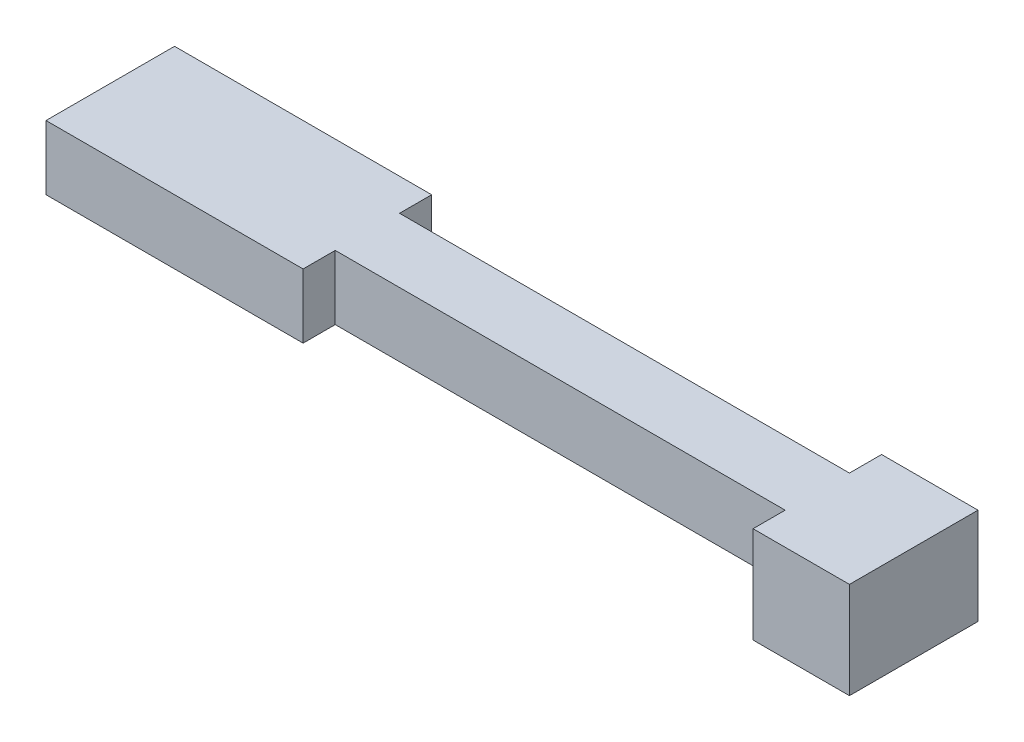
ISO-10303-21;
HEADER;
FILE_DESCRIPTION(('STEP AP214'),'2;1');
FILE_NAME('part.step','',(''),(''),'','','');
FILE_SCHEMA(('AUTOMOTIVE_DESIGN { 1 0 10303 214 1 1 1 1 }'));
ENDSEC;
DATA;
#1=APPLICATION_CONTEXT('core data for automotive mechanical design processes');
#2=APPLICATION_PROTOCOL_DEFINITION('international standard','automotive_design',2000,#1);
#3=PRODUCT_CONTEXT('',#1,'mechanical');
#4=PRODUCT('Part','Part','',(#3));
#5=PRODUCT_RELATED_PRODUCT_CATEGORY('part','',(#4));
#6=PRODUCT_DEFINITION_FORMATION('','',#4);
#7=PRODUCT_DEFINITION_CONTEXT('part definition',#1,'design');
#8=PRODUCT_DEFINITION('design','',#6,#7);
#9=PRODUCT_DEFINITION_SHAPE('','',#8);
#10=(LENGTH_UNIT() NAMED_UNIT(*) SI_UNIT(.MILLI.,.METRE.));
#11=(NAMED_UNIT(*) PLANE_ANGLE_UNIT() SI_UNIT($,.RADIAN.));
#12=(NAMED_UNIT(*) SI_UNIT($,.STERADIAN.) SOLID_ANGLE_UNIT());
#13=UNCERTAINTY_MEASURE_WITH_UNIT(LENGTH_MEASURE(1.E-05),#10,'distance_accuracy_value','');
#14=(GEOMETRIC_REPRESENTATION_CONTEXT(3) GLOBAL_UNCERTAINTY_ASSIGNED_CONTEXT((#13)) GLOBAL_UNIT_ASSIGNED_CONTEXT((#10,
#11,#12)) REPRESENTATION_CONTEXT('',''));
#15=CARTESIAN_POINT('',(0.,0.,0.));
#16=DIRECTION('',(0.,0.,1.));
#17=DIRECTION('',(1.,0.,0.));
#18=AXIS2_PLACEMENT_3D('',#15,#16,#17);
#19=CARTESIAN_POINT('',(0.,10.,-4.99999999999997));
#20=DIRECTION('',(0.,0.,-1.));
#21=DIRECTION('',(-1.,0.,0.));
#22=AXIS2_PLACEMENT_3D('',#19,#20,#21);
#23=PLANE('',#22);
#24=DIRECTION('',(1.,0.,0.));
#25=VECTOR('',#24,1.);
#26=CARTESIAN_POINT('',(0.,0.,-4.99999999999997));
#27=LINE('',#26,#25);
#28=CARTESIAN_POINT('',(20.,0.,-5.));
#29=VERTEX_POINT('',#28);
#30=CARTESIAN_POINT('',(90.,0.,-5.00000000000002));
#31=VERTEX_POINT('',#30);
#32=EDGE_CURVE('E214',#29,#31,#27,.T.);
#33=ORIENTED_EDGE('',*,*,#32,.F.);
#34=DIRECTION('',(0.,-1.,0.));
#35=VECTOR('',#34,1.);
#36=CARTESIAN_POINT('',(20.,10.,-5.));
#37=LINE('',#36,#35);
#38=CARTESIAN_POINT('',(20.,10.,-5.));
#39=VERTEX_POINT('',#38);
#40=EDGE_CURVE('E41',#39,#29,#37,.T.);
#41=ORIENTED_EDGE('',*,*,#40,.F.);
#42=DIRECTION('',(1.,0.,0.));
#43=VECTOR('',#42,1.);
#44=CARTESIAN_POINT('',(0.,10.,-4.99999999999997));
#45=LINE('',#44,#43);
#46=CARTESIAN_POINT('',(90.,10.,-5.00000000000002));
#47=VERTEX_POINT('',#46);
#48=EDGE_CURVE('E89',#39,#47,#45,.T.);
#49=ORIENTED_EDGE('',*,*,#48,.T.);
#50=DIRECTION('',(0.,-1.,0.));
#51=VECTOR('',#50,1.);
#52=CARTESIAN_POINT('',(90.,10.,-5.00000000000002));
#53=LINE('',#52,#51);
#54=EDGE_CURVE('E11',#47,#31,#53,.T.);
#55=ORIENTED_EDGE('',*,*,#54,.T.);
#56=EDGE_LOOP('',(#33,#41,#49,#55));
#57=FACE_BOUND('',#56,.T.);
#58=ADVANCED_FACE('F33',(#57),#23,.T.);
#59=CARTESIAN_POINT('',(20.,10.,0.));
#60=DIRECTION('',(-1.,0.,0.));
#61=DIRECTION('',(0.,0.,1.));
#62=AXIS2_PLACEMENT_3D('',#59,#60,#61);
#63=PLANE('',#62);
#64=DIRECTION('',(0.,0.,-1.));
#65=VECTOR('',#64,1.);
#66=CARTESIAN_POINT('',(20.,0.,0.));
#67=LINE('',#66,#65);
#68=CARTESIAN_POINT('',(20.,0.,-10.));
#69=VERTEX_POINT('',#68);
#70=EDGE_CURVE('E221',#29,#69,#67,.T.);
#71=ORIENTED_EDGE('',*,*,#70,.T.);
#72=DIRECTION('',(0.,-1.,0.));
#73=VECTOR('',#72,1.);
#74=CARTESIAN_POINT('',(20.,10.,-10.));
#75=LINE('',#74,#73);
#76=CARTESIAN_POINT('',(20.,10.,-10.));
#77=VERTEX_POINT('',#76);
#78=EDGE_CURVE('E237',#77,#69,#75,.T.);
#79=ORIENTED_EDGE('',*,*,#78,.F.);
#80=DIRECTION('',(0.,0.,-1.));
#81=VECTOR('',#80,1.);
#82=CARTESIAN_POINT('',(20.,10.,0.));
#83=LINE('',#82,#81);
#84=EDGE_CURVE('E121',#39,#77,#83,.T.);
#85=ORIENTED_EDGE('',*,*,#84,.F.);
#86=ORIENTED_EDGE('',*,*,#40,.T.);
#87=EDGE_LOOP('',(#71,#79,#85,#86));
#88=FACE_BOUND('',#87,.T.);
#89=ADVANCED_FACE('F239',(#88),#63,.F.);
#90=CARTESIAN_POINT('',(0.,10.,-10.));
#91=DIRECTION('',(0.,0.,-1.));
#92=DIRECTION('',(-1.,0.,0.));
#93=AXIS2_PLACEMENT_3D('',#90,#91,#92);
#94=PLANE('',#93);
#95=DIRECTION('',(1.,0.,0.));
#96=VECTOR('',#95,1.);
#97=CARTESIAN_POINT('',(0.,0.,-10.));
#98=LINE('',#97,#96);
#99=CARTESIAN_POINT('',(-20.,0.,-10.));
#100=VERTEX_POINT('',#99);
#101=EDGE_CURVE('E223',#100,#69,#98,.T.);
#102=ORIENTED_EDGE('',*,*,#101,.F.);
#103=DIRECTION('',(0.,-1.,0.));
#104=VECTOR('',#103,1.);
#105=CARTESIAN_POINT('',(-20.,10.,-10.));
#106=LINE('',#105,#104);
#107=CARTESIAN_POINT('',(-20.,10.,-10.));
#108=VERTEX_POINT('',#107);
#109=EDGE_CURVE('E235',#108,#100,#106,.T.);
#110=ORIENTED_EDGE('',*,*,#109,.F.);
#111=DIRECTION('',(1.,0.,0.));
#112=VECTOR('',#111,1.);
#113=CARTESIAN_POINT('',(0.,10.,-10.));
#114=LINE('',#113,#112);
#115=EDGE_CURVE('E126',#108,#77,#114,.T.);
#116=ORIENTED_EDGE('',*,*,#115,.T.);
#117=ORIENTED_EDGE('',*,*,#78,.T.);
#118=EDGE_LOOP('',(#102,#110,#116,#117));
#119=FACE_BOUND('',#118,.T.);
#120=ADVANCED_FACE('F242',(#119),#94,.T.);
#121=CARTESIAN_POINT('',(-20.,10.,0.));
#122=DIRECTION('',(-1.,0.,0.));
#123=DIRECTION('',(0.,0.,1.));
#124=AXIS2_PLACEMENT_3D('',#121,#122,#123);
#125=PLANE('',#124);
#126=DIRECTION('',(0.,0.,-1.));
#127=VECTOR('',#126,1.);
#128=CARTESIAN_POINT('',(-20.,0.,0.));
#129=LINE('',#128,#127);
#130=CARTESIAN_POINT('',(-20.,0.,10.));
#131=VERTEX_POINT('',#130);
#132=EDGE_CURVE('E228',#131,#100,#129,.T.);
#133=ORIENTED_EDGE('',*,*,#132,.F.);
#134=DIRECTION('',(0.,-1.,0.));
#135=VECTOR('',#134,1.);
#136=CARTESIAN_POINT('',(-20.,10.,10.));
#137=LINE('',#136,#135);
#138=CARTESIAN_POINT('',(-20.,10.,10.));
#139=VERTEX_POINT('',#138);
#140=EDGE_CURVE('E116',#139,#131,#137,.T.);
#141=ORIENTED_EDGE('',*,*,#140,.F.);
#142=DIRECTION('',(0.,0.,-1.));
#143=VECTOR('',#142,1.);
#144=CARTESIAN_POINT('',(-20.,10.,0.));
#145=LINE('',#144,#143);
#146=EDGE_CURVE('E112',#139,#108,#145,.T.);
#147=ORIENTED_EDGE('',*,*,#146,.T.);
#148=ORIENTED_EDGE('',*,*,#109,.T.);
#149=EDGE_LOOP('',(#133,#141,#147,#148));
#150=FACE_BOUND('',#149,.T.);
#151=ADVANCED_FACE('F245',(#150),#125,.T.);
#152=CARTESIAN_POINT('',(0.,10.,10.));
#153=DIRECTION('',(0.,0.,-1.));
#154=DIRECTION('',(-1.,0.,0.));
#155=AXIS2_PLACEMENT_3D('',#152,#153,#154);
#156=PLANE('',#155);
#157=DIRECTION('',(1.,0.,0.));
#158=VECTOR('',#157,1.);
#159=CARTESIAN_POINT('',(0.,0.,10.));
#160=LINE('',#159,#158);
#161=CARTESIAN_POINT('',(20.,0.,10.));
#162=VERTEX_POINT('',#161);
#163=EDGE_CURVE('E74',#131,#162,#160,.T.);
#164=ORIENTED_EDGE('',*,*,#163,.T.);
#165=DIRECTION('',(0.,-1.,0.));
#166=VECTOR('',#165,1.);
#167=CARTESIAN_POINT('',(20.,10.,10.));
#168=LINE('',#167,#166);
#169=CARTESIAN_POINT('',(20.,10.,10.));
#170=VERTEX_POINT('',#169);
#171=EDGE_CURVE('E114',#170,#162,#168,.T.);
#172=ORIENTED_EDGE('',*,*,#171,.F.);
#173=DIRECTION('',(1.,0.,0.));
#174=VECTOR('',#173,1.);
#175=CARTESIAN_POINT('',(0.,10.,10.));
#176=LINE('',#175,#174);
#177=EDGE_CURVE('E106',#139,#170,#176,.T.);
#178=ORIENTED_EDGE('',*,*,#177,.F.);
#179=ORIENTED_EDGE('',*,*,#140,.T.);
#180=EDGE_LOOP('',(#164,#172,#178,#179));
#181=FACE_BOUND('',#180,.T.);
#182=ADVANCED_FACE('F115',(#181),#156,.F.);
#183=CARTESIAN_POINT('',(20.,0.,4.99999999999998));
#184=VERTEX_POINT('',#183);
#185=EDGE_CURVE('E81',#162,#184,#67,.T.);
#186=ORIENTED_EDGE('',*,*,#185,.T.);
#187=DIRECTION('',(0.,-1.,0.));
#188=VECTOR('',#187,1.);
#189=CARTESIAN_POINT('',(20.,10.,4.99999999999998));
#190=LINE('',#189,#188);
#191=CARTESIAN_POINT('',(20.,10.,4.99999999999998));
#192=VERTEX_POINT('',#191);
#193=EDGE_CURVE('E117',#192,#184,#190,.T.);
#194=ORIENTED_EDGE('',*,*,#193,.F.);
#195=EDGE_CURVE('E109',#170,#192,#83,.T.);
#196=ORIENTED_EDGE('',*,*,#195,.F.);
#197=ORIENTED_EDGE('',*,*,#171,.T.);
#198=EDGE_LOOP('',(#186,#194,#196,#197));
#199=FACE_BOUND('',#198,.T.);
#200=ADVANCED_FACE('F119',(#199),#63,.F.);
#201=CARTESIAN_POINT('',(0.,10.,4.99999999999998));
#202=DIRECTION('',(0.,0.,-1.));
#203=DIRECTION('',(-1.,0.,0.));
#204=AXIS2_PLACEMENT_3D('',#201,#202,#203);
#205=PLANE('',#204);
#206=DIRECTION('',(1.,0.,0.));
#207=VECTOR('',#206,1.);
#208=CARTESIAN_POINT('',(0.,0.,4.99999999999998));
#209=LINE('',#208,#207);
#210=CARTESIAN_POINT('',(90.,0.,4.99999999999998));
#211=VERTEX_POINT('',#210);
#212=EDGE_CURVE('E130',#184,#211,#209,.T.);
#213=ORIENTED_EDGE('',*,*,#212,.T.);
#214=DIRECTION('',(0.,-1.,0.));
#215=VECTOR('',#214,1.);
#216=CARTESIAN_POINT('',(90.,10.,4.99999999999998));
#217=LINE('',#216,#215);
#218=CARTESIAN_POINT('',(90.,10.,4.99999999999998));
#219=VERTEX_POINT('',#218);
#220=EDGE_CURVE('E122',#219,#211,#217,.T.);
#221=ORIENTED_EDGE('',*,*,#220,.F.);
#222=DIRECTION('',(1.,0.,0.));
#223=VECTOR('',#222,1.);
#224=CARTESIAN_POINT('',(0.,10.,4.99999999999998));
#225=LINE('',#224,#223);
#226=EDGE_CURVE('E49',#192,#219,#225,.T.);
#227=ORIENTED_EDGE('',*,*,#226,.F.);
#228=ORIENTED_EDGE('',*,*,#193,.T.);
#229=EDGE_LOOP('',(#213,#221,#227,#228));
#230=FACE_BOUND('',#229,.T.);
#231=ADVANCED_FACE('F248',(#230),#205,.F.);
#232=CARTESIAN_POINT('',(0.,10.,0.));
#233=DIRECTION('',(0.,1.,0.));
#234=DIRECTION('',(0.,0.,1.));
#235=AXIS2_PLACEMENT_3D('',#232,#233,#234);
#236=PLANE('',#235);
#237=ORIENTED_EDGE('',*,*,#226,.T.);
#238=DIRECTION('',(0.,0.,1.));
#239=VECTOR('',#238,1.);
#240=CARTESIAN_POINT('',(90.,10.,0.));
#241=LINE('',#240,#239);
#242=CARTESIAN_POINT('',(90.,10.,9.99999999999997));
#243=VERTEX_POINT('',#242);
#244=EDGE_CURVE('E158',#219,#243,#241,.T.);
#245=ORIENTED_EDGE('',*,*,#244,.T.);
#246=DIRECTION('',(-1.,0.,0.));
#247=VECTOR('',#246,1.);
#248=CARTESIAN_POINT('',(0.,10.,9.99999999999997));
#249=LINE('',#248,#247);
#250=CARTESIAN_POINT('',(105.,10.,9.99999999999997));
#251=VERTEX_POINT('',#250);
#252=EDGE_CURVE('E152',#251,#243,#249,.T.);
#253=ORIENTED_EDGE('',*,*,#252,.F.);
#254=DIRECTION('',(0.,0.,1.));
#255=VECTOR('',#254,1.);
#256=CARTESIAN_POINT('',(105.,10.,0.));
#257=LINE('',#256,#255);
#258=CARTESIAN_POINT('',(105.,10.,-10.));
#259=VERTEX_POINT('',#258);
#260=EDGE_CURVE('E148',#259,#251,#257,.T.);
#261=ORIENTED_EDGE('',*,*,#260,.F.);
#262=DIRECTION('',(-1.,0.,0.));
#263=VECTOR('',#262,1.);
#264=CARTESIAN_POINT('',(0.,10.,-9.99999999999983));
#265=LINE('',#264,#263);
#266=CARTESIAN_POINT('',(90.,10.,-10.));
#267=VERTEX_POINT('',#266);
#268=EDGE_CURVE('E159',#259,#267,#265,.T.);
#269=ORIENTED_EDGE('',*,*,#268,.T.);
#270=EDGE_CURVE('E155',#267,#47,#241,.T.);
#271=ORIENTED_EDGE('',*,*,#270,.T.);
#272=ORIENTED_EDGE('',*,*,#48,.F.);
#273=ORIENTED_EDGE('',*,*,#84,.T.);
#274=ORIENTED_EDGE('',*,*,#115,.F.);
#275=ORIENTED_EDGE('',*,*,#146,.F.);
#276=ORIENTED_EDGE('',*,*,#177,.T.);
#277=ORIENTED_EDGE('',*,*,#195,.T.);
#278=EDGE_LOOP('',(#237,#245,#253,#261,#269,#271,#272,#273,#274,#275,#276,#277));
#279=FACE_BOUND('',#278,.T.);
#280=ADVANCED_FACE('F107',(#279),#236,.T.);
#281=CARTESIAN_POINT('',(0.,0.,0.));
#282=DIRECTION('',(0.,1.,0.));
#283=DIRECTION('',(0.,0.,1.));
#284=AXIS2_PLACEMENT_3D('',#281,#282,#283);
#285=PLANE('',#284);
#286=DIRECTION('',(0.,0.,1.));
#287=VECTOR('',#286,1.);
#288=CARTESIAN_POINT('',(90.,0.,0.));
#289=LINE('',#288,#287);
#290=EDGE_CURVE('E147',#31,#211,#289,.T.);
#291=ORIENTED_EDGE('',*,*,#290,.T.);
#292=ORIENTED_EDGE('',*,*,#212,.F.);
#293=ORIENTED_EDGE('',*,*,#185,.F.);
#294=ORIENTED_EDGE('',*,*,#163,.F.);
#295=ORIENTED_EDGE('',*,*,#132,.T.);
#296=ORIENTED_EDGE('',*,*,#101,.T.);
#297=ORIENTED_EDGE('',*,*,#70,.F.);
#298=ORIENTED_EDGE('',*,*,#32,.T.);
#299=EDGE_LOOP('',(#291,#292,#293,#294,#295,#296,#297,#298));
#300=FACE_BOUND('',#299,.T.);
#301=ADVANCED_FACE('F217',(#300),#285,.F.);
#302=CARTESIAN_POINT('',(90.,-5.,0.));
#303=DIRECTION('',(-1.,0.,0.));
#304=DIRECTION('',(0.,0.,1.));
#305=AXIS2_PLACEMENT_3D('',#302,#303,#304);
#306=PLANE('',#305);
#307=ORIENTED_EDGE('',*,*,#54,.F.);
#308=ORIENTED_EDGE('',*,*,#270,.F.);
#309=DIRECTION('',(0.,1.,0.));
#310=VECTOR('',#309,1.);
#311=CARTESIAN_POINT('',(90.,-5.,-10.));
#312=LINE('',#311,#310);
#313=CARTESIAN_POINT('',(90.,-5.,-10.));
#314=VERTEX_POINT('',#313);
#315=EDGE_CURVE('E134',#314,#267,#312,.T.);
#316=ORIENTED_EDGE('',*,*,#315,.F.);
#317=DIRECTION('',(0.,0.,1.));
#318=VECTOR('',#317,1.);
#319=CARTESIAN_POINT('',(90.,-5.,0.));
#320=LINE('',#319,#318);
#321=CARTESIAN_POINT('',(90.,-5.,9.99999999999997));
#322=VERTEX_POINT('',#321);
#323=EDGE_CURVE('E167',#314,#322,#320,.T.);
#324=ORIENTED_EDGE('',*,*,#323,.T.);
#325=DIRECTION('',(0.,1.,0.));
#326=VECTOR('',#325,1.);
#327=CARTESIAN_POINT('',(90.,-5.,9.99999999999997));
#328=LINE('',#327,#326);
#329=EDGE_CURVE('E137',#322,#243,#328,.T.);
#330=ORIENTED_EDGE('',*,*,#329,.T.);
#331=ORIENTED_EDGE('',*,*,#244,.F.);
#332=ORIENTED_EDGE('',*,*,#220,.T.);
#333=ORIENTED_EDGE('',*,*,#290,.F.);
#334=EDGE_LOOP('',(#307,#308,#316,#324,#330,#331,#332,#333));
#335=FACE_BOUND('',#334,.T.);
#336=ADVANCED_FACE('F209',(#335),#306,.T.);
#337=CARTESIAN_POINT('',(0.,-5.,-9.99999999999983));
#338=DIRECTION('',(0.,0.,-1.));
#339=DIRECTION('',(-1.,0.,0.));
#340=AXIS2_PLACEMENT_3D('',#337,#338,#339);
#341=PLANE('',#340);
#342=ORIENTED_EDGE('',*,*,#268,.F.);
#343=DIRECTION('',(0.,1.,0.));
#344=VECTOR('',#343,1.);
#345=CARTESIAN_POINT('',(105.,-5.,-10.));
#346=LINE('',#345,#344);
#347=CARTESIAN_POINT('',(105.,-5.,-10.));
#348=VERTEX_POINT('',#347);
#349=EDGE_CURVE('E144',#348,#259,#346,.T.);
#350=ORIENTED_EDGE('',*,*,#349,.F.);
#351=DIRECTION('',(-1.,0.,0.));
#352=VECTOR('',#351,1.);
#353=CARTESIAN_POINT('',(0.,-5.,-9.99999999999983));
#354=LINE('',#353,#352);
#355=EDGE_CURVE('E151',#348,#314,#354,.T.);
#356=ORIENTED_EDGE('',*,*,#355,.T.);
#357=ORIENTED_EDGE('',*,*,#315,.T.);
#358=EDGE_LOOP('',(#342,#350,#356,#357));
#359=FACE_BOUND('',#358,.T.);
#360=ADVANCED_FACE('F176',(#359),#341,.T.);
#361=CARTESIAN_POINT('',(105.,-5.,0.));
#362=DIRECTION('',(-1.,0.,0.));
#363=DIRECTION('',(0.,0.,1.));
#364=AXIS2_PLACEMENT_3D('',#361,#362,#363);
#365=PLANE('',#364);
#366=ORIENTED_EDGE('',*,*,#260,.T.);
#367=DIRECTION('',(0.,1.,0.));
#368=VECTOR('',#367,1.);
#369=CARTESIAN_POINT('',(105.,-5.,9.99999999999997));
#370=LINE('',#369,#368);
#371=CARTESIAN_POINT('',(105.,-5.,9.99999999999997));
#372=VERTEX_POINT('',#371);
#373=EDGE_CURVE('E141',#372,#251,#370,.T.);
#374=ORIENTED_EDGE('',*,*,#373,.F.);
#375=DIRECTION('',(0.,0.,1.));
#376=VECTOR('',#375,1.);
#377=CARTESIAN_POINT('',(105.,-5.,0.));
#378=LINE('',#377,#376);
#379=EDGE_CURVE('E138',#348,#372,#378,.T.);
#380=ORIENTED_EDGE('',*,*,#379,.F.);
#381=ORIENTED_EDGE('',*,*,#349,.T.);
#382=EDGE_LOOP('',(#366,#374,#380,#381));
#383=FACE_BOUND('',#382,.T.);
#384=ADVANCED_FACE('F201',(#383),#365,.F.);
#385=CARTESIAN_POINT('',(0.,-5.,9.99999999999997));
#386=DIRECTION('',(0.,0.,-1.));
#387=DIRECTION('',(-1.,0.,0.));
#388=AXIS2_PLACEMENT_3D('',#385,#386,#387);
#389=PLANE('',#388);
#390=ORIENTED_EDGE('',*,*,#252,.T.);
#391=ORIENTED_EDGE('',*,*,#329,.F.);
#392=DIRECTION('',(-1.,0.,0.));
#393=VECTOR('',#392,1.);
#394=CARTESIAN_POINT('',(0.,-5.,9.99999999999997));
#395=LINE('',#394,#393);
#396=EDGE_CURVE('E164',#372,#322,#395,.T.);
#397=ORIENTED_EDGE('',*,*,#396,.F.);
#398=ORIENTED_EDGE('',*,*,#373,.T.);
#399=EDGE_LOOP('',(#390,#391,#397,#398));
#400=FACE_BOUND('',#399,.T.);
#401=ADVANCED_FACE('F206',(#400),#389,.F.);
#402=CARTESIAN_POINT('',(0.,-5.,0.));
#403=DIRECTION('',(0.,1.,0.));
#404=DIRECTION('',(0.,0.,1.));
#405=AXIS2_PLACEMENT_3D('',#402,#403,#404);
#406=PLANE('',#405);
#407=ORIENTED_EDGE('',*,*,#355,.F.);
#408=ORIENTED_EDGE('',*,*,#379,.T.);
#409=ORIENTED_EDGE('',*,*,#396,.T.);
#410=ORIENTED_EDGE('',*,*,#323,.F.);
#411=EDGE_LOOP('',(#407,#408,#409,#410));
#412=FACE_BOUND('',#411,.T.);
#413=ADVANCED_FACE('F187',(#412),#406,.F.);
#414=CLOSED_SHELL('',(#58,#89,#120,#151,#182,#200,#231,#280,#301,#336,#360,#384,#401,#413));
#415=MANIFOLD_SOLID_BREP('B2',#414);
#416=ADVANCED_BREP_SHAPE_REPRESENTATION('',(#18,#415),#14);
#417=SHAPE_DEFINITION_REPRESENTATION(#9,#416);
ENDSEC;
END-ISO-10303-21;
